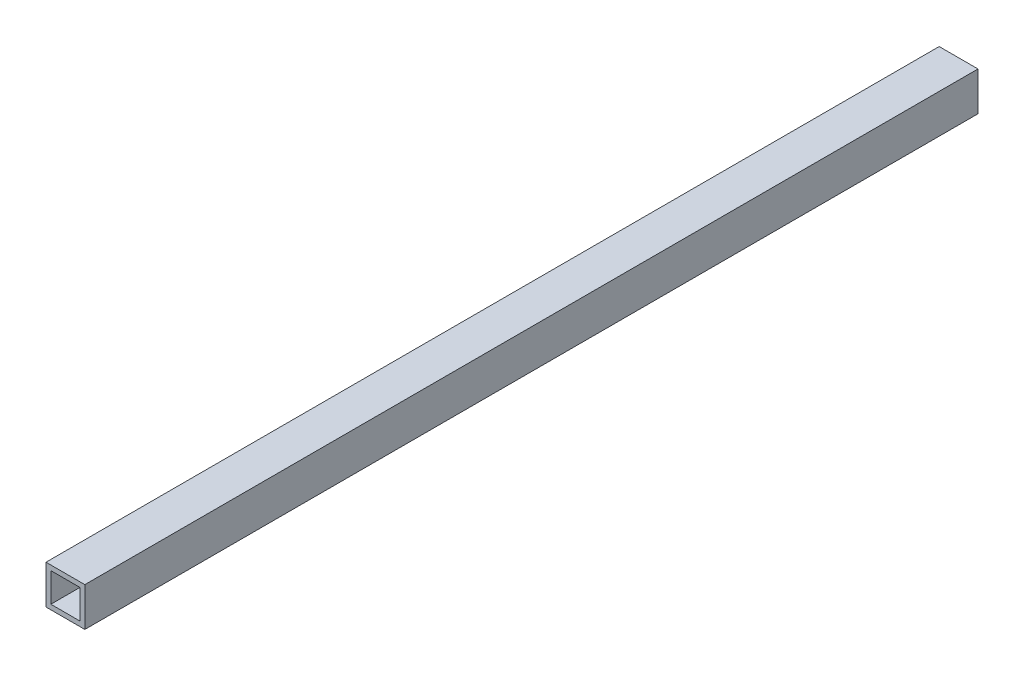
ISO-10303-21;
HEADER;
FILE_DESCRIPTION(('STEP AP214'),'2;1');
FILE_NAME('part.step','',(''),(''),'','','');
FILE_SCHEMA(('AUTOMOTIVE_DESIGN { 1 0 10303 214 1 1 1 1 }'));
ENDSEC;
DATA;
#1=APPLICATION_CONTEXT('core data for automotive mechanical design processes');
#2=APPLICATION_PROTOCOL_DEFINITION('international standard','automotive_design',2000,#1);
#3=PRODUCT_CONTEXT('',#1,'mechanical');
#4=PRODUCT('Part','Part','',(#3));
#5=PRODUCT_RELATED_PRODUCT_CATEGORY('part','',(#4));
#6=PRODUCT_DEFINITION_FORMATION('','',#4);
#7=PRODUCT_DEFINITION_CONTEXT('part definition',#1,'design');
#8=PRODUCT_DEFINITION('design','',#6,#7);
#9=PRODUCT_DEFINITION_SHAPE('','',#8);
#10=(LENGTH_UNIT() NAMED_UNIT(*) SI_UNIT(.MILLI.,.METRE.));
#11=(NAMED_UNIT(*) PLANE_ANGLE_UNIT() SI_UNIT($,.RADIAN.));
#12=(NAMED_UNIT(*) SI_UNIT($,.STERADIAN.) SOLID_ANGLE_UNIT());
#13=UNCERTAINTY_MEASURE_WITH_UNIT(LENGTH_MEASURE(1.E-05),#10,'distance_accuracy_value','');
#14=(GEOMETRIC_REPRESENTATION_CONTEXT(3) GLOBAL_UNCERTAINTY_ASSIGNED_CONTEXT((#13)) GLOBAL_UNIT_ASSIGNED_CONTEXT((#10,
#11,#12)) REPRESENTATION_CONTEXT('',''));
#15=CARTESIAN_POINT('',(0.,0.,0.));
#16=DIRECTION('',(0.,0.,1.));
#17=DIRECTION('',(1.,0.,0.));
#18=AXIS2_PLACEMENT_3D('',#15,#16,#17);
#19=CARTESIAN_POINT('',(0.,0.,584.2));
#20=DIRECTION('',(0.,0.,1.));
#21=DIRECTION('',(1.,0.,0.));
#22=AXIS2_PLACEMENT_3D('',#19,#20,#21);
#23=PLANE('',#22);
#24=DIRECTION('',(0.,-1.,0.));
#25=VECTOR('',#24,1.);
#26=CARTESIAN_POINT('',(-9.64921142042019,14.6982173962215,584.2));
#27=LINE('',#26,#25);
#28=CARTESIAN_POINT('',(-9.64921142042019,14.6982173962215,584.2));
#29=VERTEX_POINT('',#28);
#30=CARTESIAN_POINT('',(-9.64921142042019,-10.7017826037785,584.2));
#31=VERTEX_POINT('',#30);
#32=EDGE_CURVE('E134',#29,#31,#27,.T.);
#33=ORIENTED_EDGE('',*,*,#32,.T.);
#34=DIRECTION('',(1.,0.,0.));
#35=VECTOR('',#34,1.);
#36=CARTESIAN_POINT('',(-9.64921142042019,-10.7017826037785,584.2));
#37=LINE('',#36,#35);
#38=CARTESIAN_POINT('',(15.7507885795798,-10.7017826037785,584.2));
#39=VERTEX_POINT('',#38);
#40=EDGE_CURVE('E137',#31,#39,#37,.T.);
#41=ORIENTED_EDGE('',*,*,#40,.T.);
#42=DIRECTION('',(0.,1.,0.));
#43=VECTOR('',#42,1.);
#44=CARTESIAN_POINT('',(15.7507885795798,14.6982173962215,584.2));
#45=LINE('',#44,#43);
#46=CARTESIAN_POINT('',(15.7507885795798,14.6982173962215,584.2));
#47=VERTEX_POINT('',#46);
#48=EDGE_CURVE('E140',#39,#47,#45,.T.);
#49=ORIENTED_EDGE('',*,*,#48,.T.);
#50=DIRECTION('',(-1.,0.,0.));
#51=VECTOR('',#50,1.);
#52=CARTESIAN_POINT('',(-9.64921142042019,14.6982173962215,584.2));
#53=LINE('',#52,#51);
#54=EDGE_CURVE('E142',#47,#29,#53,.T.);
#55=ORIENTED_EDGE('',*,*,#54,.T.);
#56=EDGE_LOOP('',(#33,#41,#49,#55));
#57=FACE_BOUND('',#56,.T.);
#58=DIRECTION('',(1.,0.,0.));
#59=VECTOR('',#58,1.);
#60=CARTESIAN_POINT('',(-6.47421142042019,-7.52678260377854,584.2));
#61=LINE('',#60,#59);
#62=CARTESIAN_POINT('',(-6.47421142042019,-7.52678260377854,584.2));
#63=VERTEX_POINT('',#62);
#64=CARTESIAN_POINT('',(12.5757885795798,-7.52678260377854,584.2));
#65=VERTEX_POINT('',#64);
#66=EDGE_CURVE('E106',#63,#65,#61,.T.);
#67=ORIENTED_EDGE('',*,*,#66,.F.);
#68=DIRECTION('',(0.,-1.,0.));
#69=VECTOR('',#68,1.);
#70=CARTESIAN_POINT('',(-6.47421142042019,11.5232173962215,584.2));
#71=LINE('',#70,#69);
#72=CARTESIAN_POINT('',(-6.47421142042019,11.5232173962215,584.2));
#73=VERTEX_POINT('',#72);
#74=EDGE_CURVE('E98',#73,#63,#71,.T.);
#75=ORIENTED_EDGE('',*,*,#74,.F.);
#76=DIRECTION('',(-1.,0.,0.));
#77=VECTOR('',#76,1.);
#78=CARTESIAN_POINT('',(-6.47421142042019,11.5232173962215,584.2));
#79=LINE('',#78,#77);
#80=CARTESIAN_POINT('',(12.5757885795798,11.5232173962215,584.2));
#81=VERTEX_POINT('',#80);
#82=EDGE_CURVE('E120',#81,#73,#79,.T.);
#83=ORIENTED_EDGE('',*,*,#82,.F.);
#84=DIRECTION('',(0.,1.,0.));
#85=VECTOR('',#84,1.);
#86=CARTESIAN_POINT('',(12.5757885795798,11.5232173962215,584.2));
#87=LINE('',#86,#85);
#88=EDGE_CURVE('E118',#65,#81,#87,.T.);
#89=ORIENTED_EDGE('',*,*,#88,.F.);
#90=EDGE_LOOP('',(#67,#75,#83,#89));
#91=FACE_BOUND('',#90,.T.);
#92=ADVANCED_FACE('F33',(#57,#91),#23,.T.);
#93=CARTESIAN_POINT('',(0.,0.,0.));
#94=DIRECTION('',(0.,0.,1.));
#95=DIRECTION('',(1.,0.,0.));
#96=AXIS2_PLACEMENT_3D('',#93,#94,#95);
#97=PLANE('',#96);
#98=DIRECTION('',(0.,-1.,0.));
#99=VECTOR('',#98,1.);
#100=CARTESIAN_POINT('',(-9.64921142042019,14.6982173962215,0.));
#101=LINE('',#100,#99);
#102=CARTESIAN_POINT('',(-9.64921142042019,14.6982173962215,0.));
#103=VERTEX_POINT('',#102);
#104=CARTESIAN_POINT('',(-9.64921142042019,-10.7017826037785,0.));
#105=VERTEX_POINT('',#104);
#106=EDGE_CURVE('E114',#103,#105,#101,.T.);
#107=ORIENTED_EDGE('',*,*,#106,.F.);
#108=DIRECTION('',(-1.,0.,0.));
#109=VECTOR('',#108,1.);
#110=CARTESIAN_POINT('',(-9.64921142042019,14.6982173962215,0.));
#111=LINE('',#110,#109);
#112=CARTESIAN_POINT('',(15.7507885795798,14.6982173962215,0.));
#113=VERTEX_POINT('',#112);
#114=EDGE_CURVE('E138',#113,#103,#111,.T.);
#115=ORIENTED_EDGE('',*,*,#114,.F.);
#116=DIRECTION('',(0.,1.,0.));
#117=VECTOR('',#116,1.);
#118=CARTESIAN_POINT('',(15.7507885795798,14.6982173962215,0.));
#119=LINE('',#118,#117);
#120=CARTESIAN_POINT('',(15.7507885795798,-10.7017826037785,0.));
#121=VERTEX_POINT('',#120);
#122=EDGE_CURVE('E149',#121,#113,#119,.T.);
#123=ORIENTED_EDGE('',*,*,#122,.F.);
#124=DIRECTION('',(1.,0.,0.));
#125=VECTOR('',#124,1.);
#126=CARTESIAN_POINT('',(-9.64921142042019,-10.7017826037785,0.));
#127=LINE('',#126,#125);
#128=EDGE_CURVE('E147',#105,#121,#127,.T.);
#129=ORIENTED_EDGE('',*,*,#128,.F.);
#130=EDGE_LOOP('',(#107,#115,#123,#129));
#131=FACE_BOUND('',#130,.T.);
#132=DIRECTION('',(0.,-1.,0.));
#133=VECTOR('',#132,1.);
#134=CARTESIAN_POINT('',(-6.47421142042019,11.5232173962215,0.));
#135=LINE('',#134,#133);
#136=CARTESIAN_POINT('',(-6.47421142042019,11.5232173962215,0.));
#137=VERTEX_POINT('',#136);
#138=CARTESIAN_POINT('',(-6.47421142042019,-7.52678260377854,0.));
#139=VERTEX_POINT('',#138);
#140=EDGE_CURVE('E56',#137,#139,#135,.T.);
#141=ORIENTED_EDGE('',*,*,#140,.T.);
#142=DIRECTION('',(1.,0.,0.));
#143=VECTOR('',#142,1.);
#144=CARTESIAN_POINT('',(-6.47421142042019,-7.52678260377854,0.));
#145=LINE('',#144,#143);
#146=CARTESIAN_POINT('',(12.5757885795798,-7.52678260377854,0.));
#147=VERTEX_POINT('',#146);
#148=EDGE_CURVE('E113',#139,#147,#145,.T.);
#149=ORIENTED_EDGE('',*,*,#148,.T.);
#150=DIRECTION('',(0.,1.,0.));
#151=VECTOR('',#150,1.);
#152=CARTESIAN_POINT('',(12.5757885795798,11.5232173962215,0.));
#153=LINE('',#152,#151);
#154=CARTESIAN_POINT('',(12.5757885795798,11.5232173962215,0.));
#155=VERTEX_POINT('',#154);
#156=EDGE_CURVE('E126',#147,#155,#153,.T.);
#157=ORIENTED_EDGE('',*,*,#156,.T.);
#158=DIRECTION('',(-1.,0.,0.));
#159=VECTOR('',#158,1.);
#160=CARTESIAN_POINT('',(-6.47421142042019,11.5232173962215,0.));
#161=LINE('',#160,#159);
#162=EDGE_CURVE('E107',#155,#137,#161,.T.);
#163=ORIENTED_EDGE('',*,*,#162,.T.);
#164=EDGE_LOOP('',(#141,#149,#157,#163));
#165=FACE_BOUND('',#164,.T.);
#166=ADVANCED_FACE('F167',(#131,#165),#97,.F.);
#167=CARTESIAN_POINT('',(-9.64921142042019,14.6982173962215,584.2));
#168=DIRECTION('',(1.,0.,0.));
#169=DIRECTION('',(0.,0.,-1.));
#170=AXIS2_PLACEMENT_3D('',#167,#168,#169);
#171=PLANE('',#170);
#172=ORIENTED_EDGE('',*,*,#106,.T.);
#173=DIRECTION('',(0.,0.,-1.));
#174=VECTOR('',#173,1.);
#175=CARTESIAN_POINT('',(-9.64921142042019,-10.7017826037785,584.2));
#176=LINE('',#175,#174);
#177=EDGE_CURVE('E11',#31,#105,#176,.T.);
#178=ORIENTED_EDGE('',*,*,#177,.F.);
#179=ORIENTED_EDGE('',*,*,#32,.F.);
#180=DIRECTION('',(0.,0.,-1.));
#181=VECTOR('',#180,1.);
#182=CARTESIAN_POINT('',(-9.64921142042019,14.6982173962215,584.2));
#183=LINE('',#182,#181);
#184=EDGE_CURVE('E144',#29,#103,#183,.T.);
#185=ORIENTED_EDGE('',*,*,#184,.T.);
#186=EDGE_LOOP('',(#172,#178,#179,#185));
#187=FACE_BOUND('',#186,.T.);
#188=ADVANCED_FACE('F35',(#187),#171,.F.);
#189=CARTESIAN_POINT('',(-9.64921142042019,-10.7017826037785,584.2));
#190=DIRECTION('',(0.,1.,0.));
#191=DIRECTION('',(0.,0.,1.));
#192=AXIS2_PLACEMENT_3D('',#189,#190,#191);
#193=PLANE('',#192);
#194=ORIENTED_EDGE('',*,*,#128,.T.);
#195=DIRECTION('',(0.,0.,-1.));
#196=VECTOR('',#195,1.);
#197=CARTESIAN_POINT('',(15.7507885795798,-10.7017826037785,584.2));
#198=LINE('',#197,#196);
#199=EDGE_CURVE('E41',#39,#121,#198,.T.);
#200=ORIENTED_EDGE('',*,*,#199,.F.);
#201=ORIENTED_EDGE('',*,*,#40,.F.);
#202=ORIENTED_EDGE('',*,*,#177,.T.);
#203=EDGE_LOOP('',(#194,#200,#201,#202));
#204=FACE_BOUND('',#203,.T.);
#205=ADVANCED_FACE('F177',(#204),#193,.F.);
#206=CARTESIAN_POINT('',(15.7507885795798,14.6982173962215,584.2));
#207=DIRECTION('',(-1.,0.,0.));
#208=DIRECTION('',(0.,-1.,0.));
#209=AXIS2_PLACEMENT_3D('',#206,#207,#208);
#210=PLANE('',#209);
#211=ORIENTED_EDGE('',*,*,#122,.T.);
#212=DIRECTION('',(0.,0.,-1.));
#213=VECTOR('',#212,1.);
#214=CARTESIAN_POINT('',(15.7507885795798,14.6982173962215,584.2));
#215=LINE('',#214,#213);
#216=EDGE_CURVE('E154',#47,#113,#215,.T.);
#217=ORIENTED_EDGE('',*,*,#216,.F.);
#218=ORIENTED_EDGE('',*,*,#48,.F.);
#219=ORIENTED_EDGE('',*,*,#199,.T.);
#220=EDGE_LOOP('',(#211,#217,#218,#219));
#221=FACE_BOUND('',#220,.T.);
#222=ADVANCED_FACE('F161',(#221),#210,.F.);
#223=CARTESIAN_POINT('',(-9.64921142042019,14.6982173962215,584.2));
#224=DIRECTION('',(0.,-1.,0.));
#225=DIRECTION('',(0.,0.,-1.));
#226=AXIS2_PLACEMENT_3D('',#223,#224,#225);
#227=PLANE('',#226);
#228=ORIENTED_EDGE('',*,*,#114,.T.);
#229=ORIENTED_EDGE('',*,*,#184,.F.);
#230=ORIENTED_EDGE('',*,*,#54,.F.);
#231=ORIENTED_EDGE('',*,*,#216,.T.);
#232=EDGE_LOOP('',(#228,#229,#230,#231));
#233=FACE_BOUND('',#232,.T.);
#234=ADVANCED_FACE('F171',(#233),#227,.F.);
#235=CARTESIAN_POINT('',(-6.47421142042019,11.5232173962215,584.2));
#236=DIRECTION('',(1.,0.,0.));
#237=DIRECTION('',(0.,1.,0.));
#238=AXIS2_PLACEMENT_3D('',#235,#236,#237);
#239=PLANE('',#238);
#240=ORIENTED_EDGE('',*,*,#140,.F.);
#241=DIRECTION('',(0.,0.,-1.));
#242=VECTOR('',#241,1.);
#243=CARTESIAN_POINT('',(-6.47421142042019,11.5232173962215,584.2));
#244=LINE('',#243,#242);
#245=EDGE_CURVE('E102',#73,#137,#244,.T.);
#246=ORIENTED_EDGE('',*,*,#245,.F.);
#247=ORIENTED_EDGE('',*,*,#74,.T.);
#248=DIRECTION('',(0.,0.,-1.));
#249=VECTOR('',#248,1.);
#250=CARTESIAN_POINT('',(-6.47421142042019,-7.52678260377854,584.2));
#251=LINE('',#250,#249);
#252=EDGE_CURVE('E101',#63,#139,#251,.T.);
#253=ORIENTED_EDGE('',*,*,#252,.T.);
#254=EDGE_LOOP('',(#240,#246,#247,#253));
#255=FACE_BOUND('',#254,.T.);
#256=ADVANCED_FACE('F100',(#255),#239,.T.);
#257=CARTESIAN_POINT('',(-6.47421142042019,-7.52678260377854,584.2));
#258=DIRECTION('',(0.,1.,0.));
#259=DIRECTION('',(-1.,0.,0.));
#260=AXIS2_PLACEMENT_3D('',#257,#258,#259);
#261=PLANE('',#260);
#262=ORIENTED_EDGE('',*,*,#148,.F.);
#263=ORIENTED_EDGE('',*,*,#252,.F.);
#264=ORIENTED_EDGE('',*,*,#66,.T.);
#265=DIRECTION('',(0.,0.,-1.));
#266=VECTOR('',#265,1.);
#267=CARTESIAN_POINT('',(12.5757885795798,-7.52678260377854,584.2));
#268=LINE('',#267,#266);
#269=EDGE_CURVE('E115',#65,#147,#268,.T.);
#270=ORIENTED_EDGE('',*,*,#269,.T.);
#271=EDGE_LOOP('',(#262,#263,#264,#270));
#272=FACE_BOUND('',#271,.T.);
#273=ADVANCED_FACE('F110',(#272),#261,.T.);
#274=CARTESIAN_POINT('',(12.5757885795798,11.5232173962215,584.2));
#275=DIRECTION('',(-1.,0.,0.));
#276=DIRECTION('',(0.,-1.,0.));
#277=AXIS2_PLACEMENT_3D('',#274,#275,#276);
#278=PLANE('',#277);
#279=ORIENTED_EDGE('',*,*,#156,.F.);
#280=ORIENTED_EDGE('',*,*,#269,.F.);
#281=ORIENTED_EDGE('',*,*,#88,.T.);
#282=DIRECTION('',(0.,0.,-1.));
#283=VECTOR('',#282,1.);
#284=CARTESIAN_POINT('',(12.5757885795798,11.5232173962215,584.2));
#285=LINE('',#284,#283);
#286=EDGE_CURVE('E48',#81,#155,#285,.T.);
#287=ORIENTED_EDGE('',*,*,#286,.T.);
#288=EDGE_LOOP('',(#279,#280,#281,#287));
#289=FACE_BOUND('',#288,.T.);
#290=ADVANCED_FACE('F200',(#289),#278,.T.);
#291=CARTESIAN_POINT('',(-6.47421142042019,11.5232173962215,584.2));
#292=DIRECTION('',(0.,-1.,0.));
#293=DIRECTION('',(0.,0.,-1.));
#294=AXIS2_PLACEMENT_3D('',#291,#292,#293);
#295=PLANE('',#294);
#296=ORIENTED_EDGE('',*,*,#162,.F.);
#297=ORIENTED_EDGE('',*,*,#286,.F.);
#298=ORIENTED_EDGE('',*,*,#82,.T.);
#299=ORIENTED_EDGE('',*,*,#245,.T.);
#300=EDGE_LOOP('',(#296,#297,#298,#299));
#301=FACE_BOUND('',#300,.T.);
#302=ADVANCED_FACE('F204',(#301),#295,.T.);
#303=CLOSED_SHELL('',(#92,#166,#188,#205,#222,#234,#256,#273,#290,#302));
#304=MANIFOLD_SOLID_BREP('B2',#303);
#305=ADVANCED_BREP_SHAPE_REPRESENTATION('',(#18,#304),#14);
#306=SHAPE_DEFINITION_REPRESENTATION(#9,#305);
ENDSEC;
END-ISO-10303-21;
